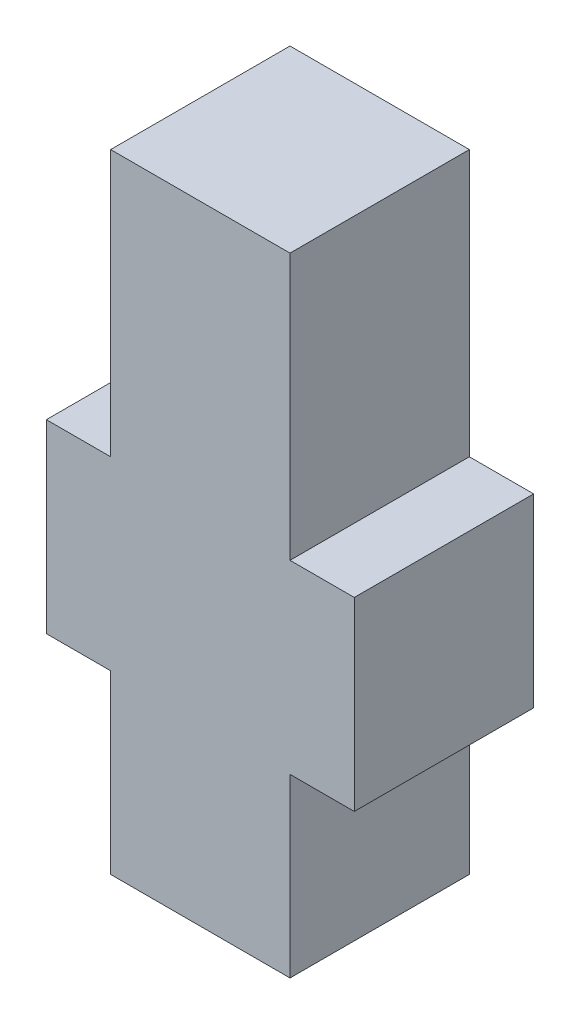
ISO-10303-21;
HEADER;
FILE_DESCRIPTION(('STEP AP214'),'2;1');
FILE_NAME('part.step','',(''),(''),'','','');
FILE_SCHEMA(('AUTOMOTIVE_DESIGN { 1 0 10303 214 1 1 1 1 }'));
ENDSEC;
DATA;
#1=APPLICATION_CONTEXT('core data for automotive mechanical design processes');
#2=APPLICATION_PROTOCOL_DEFINITION('international standard','automotive_design',2000,#1);
#3=PRODUCT_CONTEXT('',#1,'mechanical');
#4=PRODUCT('Part','Part','',(#3));
#5=PRODUCT_RELATED_PRODUCT_CATEGORY('part','',(#4));
#6=PRODUCT_DEFINITION_FORMATION('','',#4);
#7=PRODUCT_DEFINITION_CONTEXT('part definition',#1,'design');
#8=PRODUCT_DEFINITION('design','',#6,#7);
#9=PRODUCT_DEFINITION_SHAPE('','',#8);
#10=(LENGTH_UNIT() NAMED_UNIT(*) SI_UNIT(.MILLI.,.METRE.));
#11=(NAMED_UNIT(*) PLANE_ANGLE_UNIT() SI_UNIT($,.RADIAN.));
#12=(NAMED_UNIT(*) SI_UNIT($,.STERADIAN.) SOLID_ANGLE_UNIT());
#13=UNCERTAINTY_MEASURE_WITH_UNIT(LENGTH_MEASURE(1.E-05),#10,'distance_accuracy_value','');
#14=(GEOMETRIC_REPRESENTATION_CONTEXT(3) GLOBAL_UNCERTAINTY_ASSIGNED_CONTEXT((#13)) GLOBAL_UNIT_ASSIGNED_CONTEXT((#10,
#11,#12)) REPRESENTATION_CONTEXT('',''));
#15=CARTESIAN_POINT('',(0.,0.,0.));
#16=DIRECTION('',(0.,0.,1.));
#17=DIRECTION('',(1.,0.,0.));
#18=AXIS2_PLACEMENT_3D('',#15,#16,#17);
#19=CARTESIAN_POINT('',(-3.,0.,6.));
#20=DIRECTION('',(1.,0.,0.));
#21=DIRECTION('',(0.,0.,-1.));
#22=AXIS2_PLACEMENT_3D('',#19,#20,#21);
#23=PLANE('',#22);
#24=DIRECTION('',(0.,0.,1.));
#25=VECTOR('',#24,1.);
#26=CARTESIAN_POINT('',(-3.,-15.1,6.));
#27=LINE('',#26,#25);
#28=CARTESIAN_POINT('',(-3.,-15.1,0.));
#29=VERTEX_POINT('',#28);
#30=CARTESIAN_POINT('',(-3.,-15.1,6.));
#31=VERTEX_POINT('',#30);
#32=EDGE_CURVE('E140',#29,#31,#27,.T.);
#33=ORIENTED_EDGE('',*,*,#32,.F.);
#34=DIRECTION('',(0.,-1.,0.));
#35=VECTOR('',#34,1.);
#36=CARTESIAN_POINT('',(-3.,0.,0.));
#37=LINE('',#36,#35);
#38=CARTESIAN_POINT('',(-3.,-21.,0.));
#39=VERTEX_POINT('',#38);
#40=EDGE_CURVE('E173',#29,#39,#37,.T.);
#41=ORIENTED_EDGE('',*,*,#40,.T.);
#42=DIRECTION('',(0.,0.,-1.));
#43=VECTOR('',#42,1.);
#44=CARTESIAN_POINT('',(-3.,-21.,6.));
#45=LINE('',#44,#43);
#46=CARTESIAN_POINT('',(-3.,-21.,6.));
#47=VERTEX_POINT('',#46);
#48=EDGE_CURVE('E11',#47,#39,#45,.T.);
#49=ORIENTED_EDGE('',*,*,#48,.F.);
#50=DIRECTION('',(0.,-1.,0.));
#51=VECTOR('',#50,1.);
#52=CARTESIAN_POINT('',(-3.,0.,6.));
#53=LINE('',#52,#51);
#54=EDGE_CURVE('E177',#31,#47,#53,.T.);
#55=ORIENTED_EDGE('',*,*,#54,.F.);
#56=EDGE_LOOP('',(#33,#41,#49,#55));
#57=FACE_BOUND('',#56,.T.);
#58=ADVANCED_FACE('F41',(#57),#23,.F.);
#59=DIRECTION('',(0.,0.,-1.));
#60=VECTOR('',#59,1.);
#61=CARTESIAN_POINT('',(-3.,-8.9,6.));
#62=LINE('',#61,#60);
#63=CARTESIAN_POINT('',(-3.,-8.9,6.));
#64=VERTEX_POINT('',#63);
#65=CARTESIAN_POINT('',(-3.,-8.9,0.));
#66=VERTEX_POINT('',#65);
#67=EDGE_CURVE('E162',#64,#66,#62,.T.);
#68=ORIENTED_EDGE('',*,*,#67,.F.);
#69=CARTESIAN_POINT('',(-3.,0.,6.));
#70=VERTEX_POINT('',#69);
#71=EDGE_CURVE('E174',#70,#64,#53,.T.);
#72=ORIENTED_EDGE('',*,*,#71,.F.);
#73=DIRECTION('',(0.,0.,-1.));
#74=VECTOR('',#73,1.);
#75=CARTESIAN_POINT('',(-3.,0.,6.));
#76=LINE('',#75,#74);
#77=CARTESIAN_POINT('',(-3.,0.,0.));
#78=VERTEX_POINT('',#77);
#79=EDGE_CURVE('E183',#70,#78,#76,.T.);
#80=ORIENTED_EDGE('',*,*,#79,.T.);
#81=EDGE_CURVE('E184',#78,#66,#37,.T.);
#82=ORIENTED_EDGE('',*,*,#81,.T.);
#83=EDGE_LOOP('',(#68,#72,#80,#82));
#84=FACE_BOUND('',#83,.T.);
#85=ADVANCED_FACE('F250',(#84),#23,.F.);
#86=CARTESIAN_POINT('',(3.,-21.,6.));
#87=DIRECTION('',(-1.,0.,0.));
#88=DIRECTION('',(0.,0.,1.));
#89=AXIS2_PLACEMENT_3D('',#86,#87,#88);
#90=PLANE('',#89);
#91=DIRECTION('',(0.,0.,-1.));
#92=VECTOR('',#91,1.);
#93=CARTESIAN_POINT('',(3.,-15.1,6.));
#94=LINE('',#93,#92);
#95=CARTESIAN_POINT('',(3.,-15.1,6.));
#96=VERTEX_POINT('',#95);
#97=CARTESIAN_POINT('',(3.,-15.1,0.));
#98=VERTEX_POINT('',#97);
#99=EDGE_CURVE('E63',#96,#98,#94,.T.);
#100=ORIENTED_EDGE('',*,*,#99,.F.);
#101=DIRECTION('',(0.,1.,0.));
#102=VECTOR('',#101,1.);
#103=CARTESIAN_POINT('',(3.,-21.,6.));
#104=LINE('',#103,#102);
#105=CARTESIAN_POINT('',(3.,-21.,6.));
#106=VERTEX_POINT('',#105);
#107=EDGE_CURVE('E179',#106,#96,#104,.T.);
#108=ORIENTED_EDGE('',*,*,#107,.F.);
#109=DIRECTION('',(0.,0.,-1.));
#110=VECTOR('',#109,1.);
#111=CARTESIAN_POINT('',(3.,-21.,6.));
#112=LINE('',#111,#110);
#113=CARTESIAN_POINT('',(3.,-21.,0.));
#114=VERTEX_POINT('',#113);
#115=EDGE_CURVE('E48',#106,#114,#112,.T.);
#116=ORIENTED_EDGE('',*,*,#115,.T.);
#117=DIRECTION('',(0.,1.,0.));
#118=VECTOR('',#117,1.);
#119=CARTESIAN_POINT('',(3.,-21.,0.));
#120=LINE('',#119,#118);
#121=EDGE_CURVE('E189',#114,#98,#120,.T.);
#122=ORIENTED_EDGE('',*,*,#121,.T.);
#123=EDGE_LOOP('',(#100,#108,#116,#122));
#124=FACE_BOUND('',#123,.T.);
#125=ADVANCED_FACE('F200',(#124),#90,.F.);
#126=DIRECTION('',(0.,0.,1.));
#127=VECTOR('',#126,1.);
#128=CARTESIAN_POINT('',(3.,-8.9,6.));
#129=LINE('',#128,#127);
#130=CARTESIAN_POINT('',(3.,-8.9,0.));
#131=VERTEX_POINT('',#130);
#132=CARTESIAN_POINT('',(3.,-8.9,6.));
#133=VERTEX_POINT('',#132);
#134=EDGE_CURVE('E159',#131,#133,#129,.T.);
#135=ORIENTED_EDGE('',*,*,#134,.F.);
#136=CARTESIAN_POINT('',(3.,0.,0.));
#137=VERTEX_POINT('',#136);
#138=EDGE_CURVE('E188',#131,#137,#120,.T.);
#139=ORIENTED_EDGE('',*,*,#138,.T.);
#140=DIRECTION('',(0.,0.,-1.));
#141=VECTOR('',#140,1.);
#142=CARTESIAN_POINT('',(3.,0.,6.));
#143=LINE('',#142,#141);
#144=CARTESIAN_POINT('',(3.,0.,6.));
#145=VERTEX_POINT('',#144);
#146=EDGE_CURVE('E195',#145,#137,#143,.T.);
#147=ORIENTED_EDGE('',*,*,#146,.F.);
#148=EDGE_CURVE('E55',#133,#145,#104,.T.);
#149=ORIENTED_EDGE('',*,*,#148,.F.);
#150=EDGE_LOOP('',(#135,#139,#147,#149));
#151=FACE_BOUND('',#150,.T.);
#152=ADVANCED_FACE('F234',(#151),#90,.F.);
#153=CARTESIAN_POINT('',(-3.,-21.,6.));
#154=DIRECTION('',(0.,1.,0.));
#155=DIRECTION('',(0.,0.,1.));
#156=AXIS2_PLACEMENT_3D('',#153,#154,#155);
#157=PLANE('',#156);
#158=DIRECTION('',(1.,0.,0.));
#159=VECTOR('',#158,1.);
#160=CARTESIAN_POINT('',(-3.,-21.,0.));
#161=LINE('',#160,#159);
#162=EDGE_CURVE('E186',#39,#114,#161,.T.);
#163=ORIENTED_EDGE('',*,*,#162,.T.);
#164=ORIENTED_EDGE('',*,*,#115,.F.);
#165=DIRECTION('',(1.,0.,0.));
#166=VECTOR('',#165,1.);
#167=CARTESIAN_POINT('',(-3.,-21.,6.));
#168=LINE('',#167,#166);
#169=EDGE_CURVE('E176',#47,#106,#168,.T.);
#170=ORIENTED_EDGE('',*,*,#169,.F.);
#171=ORIENTED_EDGE('',*,*,#48,.T.);
#172=EDGE_LOOP('',(#163,#164,#170,#171));
#173=FACE_BOUND('',#172,.T.);
#174=ADVANCED_FACE('F265',(#173),#157,.F.);
#175=CARTESIAN_POINT('',(3.,0.,6.));
#176=DIRECTION('',(0.,-1.,0.));
#177=DIRECTION('',(0.,0.,-1.));
#178=AXIS2_PLACEMENT_3D('',#175,#176,#177);
#179=PLANE('',#178);
#180=DIRECTION('',(-1.,0.,0.));
#181=VECTOR('',#180,1.);
#182=CARTESIAN_POINT('',(3.,0.,0.));
#183=LINE('',#182,#181);
#184=EDGE_CURVE('E191',#137,#78,#183,.T.);
#185=ORIENTED_EDGE('',*,*,#184,.T.);
#186=ORIENTED_EDGE('',*,*,#79,.F.);
#187=DIRECTION('',(-1.,0.,0.));
#188=VECTOR('',#187,1.);
#189=CARTESIAN_POINT('',(3.,0.,6.));
#190=LINE('',#189,#188);
#191=EDGE_CURVE('E181',#145,#70,#190,.T.);
#192=ORIENTED_EDGE('',*,*,#191,.F.);
#193=ORIENTED_EDGE('',*,*,#146,.T.);
#194=EDGE_LOOP('',(#185,#186,#192,#193));
#195=FACE_BOUND('',#194,.T.);
#196=ADVANCED_FACE('F264',(#195),#179,.F.);
#197=CARTESIAN_POINT('',(0.,0.,6.));
#198=DIRECTION('',(0.,0.,1.));
#199=DIRECTION('',(1.,0.,0.));
#200=AXIS2_PLACEMENT_3D('',#197,#198,#199);
#201=PLANE('',#200);
#202=ORIENTED_EDGE('',*,*,#71,.T.);
#203=DIRECTION('',(-1.,0.,0.));
#204=VECTOR('',#203,1.);
#205=CARTESIAN_POINT('',(5.15,-8.9,6.));
#206=LINE('',#205,#204);
#207=CARTESIAN_POINT('',(-5.15,-8.9,6.));
#208=VERTEX_POINT('',#207);
#209=EDGE_CURVE('E150',#64,#208,#206,.T.);
#210=ORIENTED_EDGE('',*,*,#209,.T.);
#211=DIRECTION('',(0.,-1.,0.));
#212=VECTOR('',#211,1.);
#213=CARTESIAN_POINT('',(-5.15,-8.9,6.));
#214=LINE('',#213,#212);
#215=CARTESIAN_POINT('',(-5.15,-15.1,6.));
#216=VERTEX_POINT('',#215);
#217=EDGE_CURVE('E146',#208,#216,#214,.T.);
#218=ORIENTED_EDGE('',*,*,#217,.T.);
#219=DIRECTION('',(1.,0.,0.));
#220=VECTOR('',#219,1.);
#221=CARTESIAN_POINT('',(-5.15,-15.1,6.));
#222=LINE('',#221,#220);
#223=EDGE_CURVE('E132',#216,#31,#222,.T.);
#224=ORIENTED_EDGE('',*,*,#223,.T.);
#225=ORIENTED_EDGE('',*,*,#54,.T.);
#226=ORIENTED_EDGE('',*,*,#169,.T.);
#227=ORIENTED_EDGE('',*,*,#107,.T.);
#228=CARTESIAN_POINT('',(5.15,-15.1,6.));
#229=VERTEX_POINT('',#228);
#230=EDGE_CURVE('E143',#96,#229,#222,.T.);
#231=ORIENTED_EDGE('',*,*,#230,.T.);
#232=DIRECTION('',(0.,1.,0.));
#233=VECTOR('',#232,1.);
#234=CARTESIAN_POINT('',(5.15,-15.1,6.));
#235=LINE('',#234,#233);
#236=CARTESIAN_POINT('',(5.15,-8.9,6.));
#237=VERTEX_POINT('',#236);
#238=EDGE_CURVE('E142',#229,#237,#235,.T.);
#239=ORIENTED_EDGE('',*,*,#238,.T.);
#240=EDGE_CURVE('E223',#237,#133,#206,.T.);
#241=ORIENTED_EDGE('',*,*,#240,.T.);
#242=ORIENTED_EDGE('',*,*,#148,.T.);
#243=ORIENTED_EDGE('',*,*,#191,.T.);
#244=EDGE_LOOP('',(#202,#210,#218,#224,#225,#226,#227,#231,#239,#241,#242,#243));
#245=FACE_BOUND('',#244,.T.);
#246=ADVANCED_FACE('F148',(#245),#201,.T.);
#247=CARTESIAN_POINT('',(0.,0.,0.));
#248=DIRECTION('',(0.,0.,1.));
#249=DIRECTION('',(1.,0.,0.));
#250=AXIS2_PLACEMENT_3D('',#247,#248,#249);
#251=PLANE('',#250);
#252=ORIENTED_EDGE('',*,*,#138,.F.);
#253=DIRECTION('',(-1.,0.,0.));
#254=VECTOR('',#253,1.);
#255=CARTESIAN_POINT('',(5.15,-8.9,0.));
#256=LINE('',#255,#254);
#257=CARTESIAN_POINT('',(5.15,-8.9,0.));
#258=VERTEX_POINT('',#257);
#259=EDGE_CURVE('E154',#258,#131,#256,.T.);
#260=ORIENTED_EDGE('',*,*,#259,.F.);
#261=DIRECTION('',(0.,1.,0.));
#262=VECTOR('',#261,1.);
#263=CARTESIAN_POINT('',(5.15,-15.1,0.));
#264=LINE('',#263,#262);
#265=CARTESIAN_POINT('',(5.15,-15.1,0.));
#266=VERTEX_POINT('',#265);
#267=EDGE_CURVE('E210',#266,#258,#264,.T.);
#268=ORIENTED_EDGE('',*,*,#267,.F.);
#269=DIRECTION('',(1.,0.,0.));
#270=VECTOR('',#269,1.);
#271=CARTESIAN_POINT('',(-5.15,-15.1,0.));
#272=LINE('',#271,#270);
#273=EDGE_CURVE('E208',#98,#266,#272,.T.);
#274=ORIENTED_EDGE('',*,*,#273,.F.);
#275=ORIENTED_EDGE('',*,*,#121,.F.);
#276=ORIENTED_EDGE('',*,*,#162,.F.);
#277=ORIENTED_EDGE('',*,*,#40,.F.);
#278=CARTESIAN_POINT('',(-5.15,-15.1,0.));
#279=VERTEX_POINT('',#278);
#280=EDGE_CURVE('E213',#279,#29,#272,.T.);
#281=ORIENTED_EDGE('',*,*,#280,.F.);
#282=DIRECTION('',(0.,-1.,0.));
#283=VECTOR('',#282,1.);
#284=CARTESIAN_POINT('',(-5.15,-8.9,0.));
#285=LINE('',#284,#283);
#286=CARTESIAN_POINT('',(-5.15,-8.9,0.));
#287=VERTEX_POINT('',#286);
#288=EDGE_CURVE('E158',#287,#279,#285,.T.);
#289=ORIENTED_EDGE('',*,*,#288,.F.);
#290=EDGE_CURVE('E219',#66,#287,#256,.T.);
#291=ORIENTED_EDGE('',*,*,#290,.F.);
#292=ORIENTED_EDGE('',*,*,#81,.F.);
#293=ORIENTED_EDGE('',*,*,#184,.F.);
#294=EDGE_LOOP('',(#252,#260,#268,#274,#275,#276,#277,#281,#289,#291,#292,#293));
#295=FACE_BOUND('',#294,.T.);
#296=ADVANCED_FACE('F206',(#295),#251,.F.);
#297=CARTESIAN_POINT('',(5.15,-15.1,6.));
#298=DIRECTION('',(-1.,0.,0.));
#299=DIRECTION('',(0.,0.,1.));
#300=AXIS2_PLACEMENT_3D('',#297,#298,#299);
#301=PLANE('',#300);
#302=ORIENTED_EDGE('',*,*,#267,.T.);
#303=DIRECTION('',(0.,0.,-1.));
#304=VECTOR('',#303,1.);
#305=CARTESIAN_POINT('',(5.15,-8.9,6.));
#306=LINE('',#305,#304);
#307=EDGE_CURVE('E165',#237,#258,#306,.T.);
#308=ORIENTED_EDGE('',*,*,#307,.F.);
#309=ORIENTED_EDGE('',*,*,#238,.F.);
#310=DIRECTION('',(0.,0.,-1.));
#311=VECTOR('',#310,1.);
#312=CARTESIAN_POINT('',(5.15,-15.1,6.));
#313=LINE('',#312,#311);
#314=EDGE_CURVE('E160',#229,#266,#313,.T.);
#315=ORIENTED_EDGE('',*,*,#314,.T.);
#316=EDGE_LOOP('',(#302,#308,#309,#315));
#317=FACE_BOUND('',#316,.T.);
#318=ADVANCED_FACE('F237',(#317),#301,.F.);
#319=CARTESIAN_POINT('',(5.15,-8.9,6.));
#320=DIRECTION('',(0.,-1.,0.));
#321=DIRECTION('',(0.,0.,-1.));
#322=AXIS2_PLACEMENT_3D('',#319,#320,#321);
#323=PLANE('',#322);
#324=ORIENTED_EDGE('',*,*,#259,.T.);
#325=ORIENTED_EDGE('',*,*,#134,.T.);
#326=ORIENTED_EDGE('',*,*,#240,.F.);
#327=ORIENTED_EDGE('',*,*,#307,.T.);
#328=EDGE_LOOP('',(#324,#325,#326,#327));
#329=FACE_BOUND('',#328,.T.);
#330=ADVANCED_FACE('F228',(#329),#323,.F.);
#331=CARTESIAN_POINT('',(-5.15,-15.1,6.));
#332=DIRECTION('',(0.,1.,0.));
#333=DIRECTION('',(0.,0.,1.));
#334=AXIS2_PLACEMENT_3D('',#331,#332,#333);
#335=PLANE('',#334);
#336=ORIENTED_EDGE('',*,*,#230,.F.);
#337=ORIENTED_EDGE('',*,*,#99,.T.);
#338=ORIENTED_EDGE('',*,*,#273,.T.);
#339=ORIENTED_EDGE('',*,*,#314,.F.);
#340=EDGE_LOOP('',(#336,#337,#338,#339));
#341=FACE_BOUND('',#340,.T.);
#342=ADVANCED_FACE('F238',(#341),#335,.F.);
#343=ORIENTED_EDGE('',*,*,#280,.T.);
#344=ORIENTED_EDGE('',*,*,#32,.T.);
#345=ORIENTED_EDGE('',*,*,#223,.F.);
#346=DIRECTION('',(0.,0.,-1.));
#347=VECTOR('',#346,1.);
#348=CARTESIAN_POINT('',(-5.15,-15.1,6.));
#349=LINE('',#348,#347);
#350=EDGE_CURVE('E137',#216,#279,#349,.T.);
#351=ORIENTED_EDGE('',*,*,#350,.T.);
#352=EDGE_LOOP('',(#343,#344,#345,#351));
#353=FACE_BOUND('',#352,.T.);
#354=ADVANCED_FACE('F135',(#353),#335,.F.);
#355=ORIENTED_EDGE('',*,*,#209,.F.);
#356=ORIENTED_EDGE('',*,*,#67,.T.);
#357=ORIENTED_EDGE('',*,*,#290,.T.);
#358=DIRECTION('',(0.,0.,-1.));
#359=VECTOR('',#358,1.);
#360=CARTESIAN_POINT('',(-5.15,-8.9,6.));
#361=LINE('',#360,#359);
#362=EDGE_CURVE('E222',#208,#287,#361,.T.);
#363=ORIENTED_EDGE('',*,*,#362,.F.);
#364=EDGE_LOOP('',(#355,#356,#357,#363));
#365=FACE_BOUND('',#364,.T.);
#366=ADVANCED_FACE('F245',(#365),#323,.F.);
#367=CARTESIAN_POINT('',(-5.15,-8.9,6.));
#368=DIRECTION('',(1.,0.,0.));
#369=DIRECTION('',(0.,0.,-1.));
#370=AXIS2_PLACEMENT_3D('',#367,#368,#369);
#371=PLANE('',#370);
#372=ORIENTED_EDGE('',*,*,#288,.T.);
#373=ORIENTED_EDGE('',*,*,#350,.F.);
#374=ORIENTED_EDGE('',*,*,#217,.F.);
#375=ORIENTED_EDGE('',*,*,#362,.T.);
#376=EDGE_LOOP('',(#372,#373,#374,#375));
#377=FACE_BOUND('',#376,.T.);
#378=ADVANCED_FACE('F156',(#377),#371,.F.);
#379=CLOSED_SHELL('',(#58,#85,#125,#152,#174,#196,#246,#296,#318,#330,#342,#354,#366,#378));
#380=MANIFOLD_SOLID_BREP('B2',#379);
#381=ADVANCED_BREP_SHAPE_REPRESENTATION('',(#18,#380),#14);
#382=SHAPE_DEFINITION_REPRESENTATION(#9,#381);
ENDSEC;
END-ISO-10303-21;
